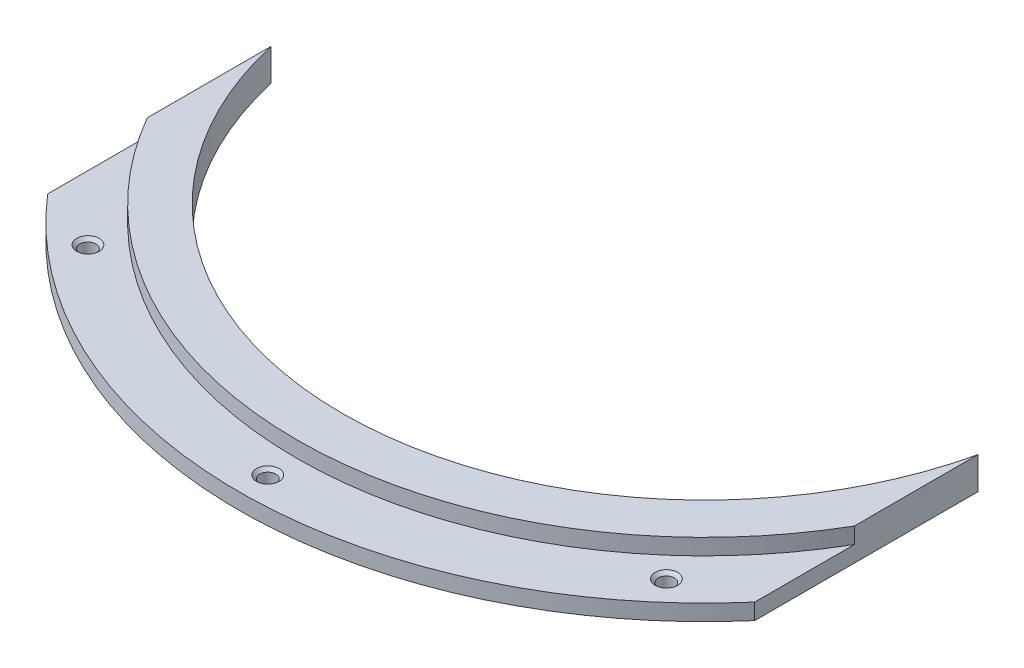
ISO-10303-21;
HEADER;
FILE_DESCRIPTION(('STEP AP214'),'2;1');
FILE_NAME('part.step','',(''),(''),'','','');
FILE_SCHEMA(('AUTOMOTIVE_DESIGN { 1 0 10303 214 1 1 1 1 }'));
ENDSEC;
DATA;
#1=APPLICATION_CONTEXT('core data for automotive mechanical design processes');
#2=APPLICATION_PROTOCOL_DEFINITION('international standard','automotive_design',2000,#1);
#3=PRODUCT_CONTEXT('',#1,'mechanical');
#4=PRODUCT('Part','Part','',(#3));
#5=PRODUCT_RELATED_PRODUCT_CATEGORY('part','',(#4));
#6=PRODUCT_DEFINITION_FORMATION('','',#4);
#7=PRODUCT_DEFINITION_CONTEXT('part definition',#1,'design');
#8=PRODUCT_DEFINITION('design','',#6,#7);
#9=PRODUCT_DEFINITION_SHAPE('','',#8);
#10=(LENGTH_UNIT() NAMED_UNIT(*) SI_UNIT(.MILLI.,.METRE.));
#11=(NAMED_UNIT(*) PLANE_ANGLE_UNIT() SI_UNIT($,.RADIAN.));
#12=(NAMED_UNIT(*) SI_UNIT($,.STERADIAN.) SOLID_ANGLE_UNIT());
#13=UNCERTAINTY_MEASURE_WITH_UNIT(LENGTH_MEASURE(1.E-05),#10,'distance_accuracy_value','');
#14=(GEOMETRIC_REPRESENTATION_CONTEXT(3) GLOBAL_UNCERTAINTY_ASSIGNED_CONTEXT((#13)) GLOBAL_UNIT_ASSIGNED_CONTEXT((#10,
#11,#12)) REPRESENTATION_CONTEXT('',''));
#15=CARTESIAN_POINT('',(0.,0.,0.));
#16=DIRECTION('',(0.,0.,1.));
#17=DIRECTION('',(1.,0.,0.));
#18=AXIS2_PLACEMENT_3D('',#15,#16,#17);
#19=CARTESIAN_POINT('',(139.7,12.7,-279.4));
#20=DIRECTION('',(0.,-1.,0.));
#21=DIRECTION('',(0.,0.,-1.));
#22=AXIS2_PLACEMENT_3D('',#19,#20,#21);
#23=CYLINDRICAL_SURFACE('',#22,161.29);
#24=CARTESIAN_POINT('',(139.7,6.35,-279.4));
#25=DIRECTION('',(0.,1.,0.));
#26=DIRECTION('',(0.,0.,-1.));
#27=AXIS2_PLACEMENT_3D('',#24,#25,#26);
#28=CIRCLE('',#27,161.29);
#29=CARTESIAN_POINT('',(0.,6.35,-198.787506551404));
#30=VERTEX_POINT('',#29);
#31=CARTESIAN_POINT('',(279.4,6.35,-198.787506551404));
#32=VERTEX_POINT('',#31);
#33=EDGE_CURVE('E68',#30,#32,#28,.T.);
#34=ORIENTED_EDGE('',*,*,#33,.T.);
#35=DIRECTION('',(0.,-1.,0.));
#36=VECTOR('',#35,1.);
#37=CARTESIAN_POINT('',(279.4,12.7,-198.787506551404));
#38=LINE('',#37,#36);
#39=CARTESIAN_POINT('',(279.4,12.7,-198.787506551404));
#40=VERTEX_POINT('',#39);
#41=EDGE_CURVE('E129',#40,#32,#38,.T.);
#42=ORIENTED_EDGE('',*,*,#41,.F.);
#43=CARTESIAN_POINT('',(139.7,12.7,-279.4));
#44=DIRECTION('',(0.,1.,0.));
#45=DIRECTION('',(0.,0.,1.));
#46=AXIS2_PLACEMENT_3D('',#43,#44,#45);
#47=CIRCLE('',#46,161.29);
#48=CARTESIAN_POINT('',(0.,12.7,-198.787506551404));
#49=VERTEX_POINT('',#48);
#50=EDGE_CURVE('E139',#49,#40,#47,.T.);
#51=ORIENTED_EDGE('',*,*,#50,.F.);
#52=DIRECTION('',(0.,-1.,0.));
#53=VECTOR('',#52,1.);
#54=CARTESIAN_POINT('',(0.,12.7,-198.787506551404));
#55=LINE('',#54,#53);
#56=EDGE_CURVE('E73',#49,#30,#55,.T.);
#57=ORIENTED_EDGE('',*,*,#56,.T.);
#58=EDGE_LOOP('',(#34,#42,#51,#57));
#59=FACE_BOUND('',#58,.T.);
#60=ADVANCED_FACE('F52',(#59),#23,.T.);
#61=CARTESIAN_POINT('',(279.4,12.7,-247.65));
#62=DIRECTION('',(-1.,0.,0.));
#63=DIRECTION('',(0.,0.,1.));
#64=AXIS2_PLACEMENT_3D('',#61,#62,#63);
#65=PLANE('',#64);
#66=DIRECTION('',(0.,0.,-1.));
#67=VECTOR('',#66,1.);
#68=CARTESIAN_POINT('',(279.4,0.,-247.65));
#69=LINE('',#68,#67);
#70=CARTESIAN_POINT('',(279.4,0.,-159.420282964161));
#71=VERTEX_POINT('',#70);
#72=CARTESIAN_POINT('',(279.4,0.,-247.65));
#73=VERTEX_POINT('',#72);
#74=EDGE_CURVE('E137',#71,#73,#69,.T.);
#75=ORIENTED_EDGE('',*,*,#74,.T.);
#76=DIRECTION('',(0.,-1.,0.));
#77=VECTOR('',#76,1.);
#78=CARTESIAN_POINT('',(279.4,12.7,-247.65));
#79=LINE('',#78,#77);
#80=CARTESIAN_POINT('',(279.4,12.7,-247.65));
#81=VERTEX_POINT('',#80);
#82=EDGE_CURVE('E161',#81,#73,#79,.T.);
#83=ORIENTED_EDGE('',*,*,#82,.F.);
#84=DIRECTION('',(0.,0.,-1.));
#85=VECTOR('',#84,1.);
#86=CARTESIAN_POINT('',(279.4,12.7,-247.65));
#87=LINE('',#86,#85);
#88=EDGE_CURVE('E142',#40,#81,#87,.T.);
#89=ORIENTED_EDGE('',*,*,#88,.F.);
#90=ORIENTED_EDGE('',*,*,#41,.T.);
#91=DIRECTION('',(0.,0.,1.));
#92=VECTOR('',#91,1.);
#93=CARTESIAN_POINT('',(279.4,6.35,-198.787506551404));
#94=LINE('',#93,#92);
#95=CARTESIAN_POINT('',(279.4,6.35,-159.420282964161));
#96=VERTEX_POINT('',#95);
#97=EDGE_CURVE('E125',#32,#96,#94,.T.);
#98=ORIENTED_EDGE('',*,*,#97,.T.);
#99=DIRECTION('',(0.,-1.,0.));
#100=VECTOR('',#99,1.);
#101=CARTESIAN_POINT('',(279.4,6.35,-159.420282964161));
#102=LINE('',#101,#100);
#103=EDGE_CURVE('E109',#96,#71,#102,.T.);
#104=ORIENTED_EDGE('',*,*,#103,.T.);
#105=EDGE_LOOP('',(#75,#83,#89,#90,#98,#104));
#106=FACE_BOUND('',#105,.T.);
#107=ADVANCED_FACE('F128',(#106),#65,.F.);
#108=CARTESIAN_POINT('',(139.7,12.7,-279.4));
#109=DIRECTION('',(0.,-1.,0.));
#110=DIRECTION('',(0.,0.,-1.));
#111=AXIS2_PLACEMENT_3D('',#108,#109,#110);
#112=CYLINDRICAL_SURFACE('',#111,143.262529993017);
#113=CARTESIAN_POINT('',(139.7,0.,-279.4));
#114=DIRECTION('',(0.,-1.,0.));
#115=DIRECTION('',(0.,0.,1.));
#116=AXIS2_PLACEMENT_3D('',#113,#114,#115);
#117=CIRCLE('',#116,143.262529993017);
#118=CARTESIAN_POINT('',(0.,0.,-247.65));
#119=VERTEX_POINT('',#118);
#120=EDGE_CURVE('E153',#73,#119,#117,.T.);
#121=ORIENTED_EDGE('',*,*,#120,.T.);
#122=DIRECTION('',(0.,-1.,0.));
#123=VECTOR('',#122,1.);
#124=CARTESIAN_POINT('',(0.,12.7,-247.65));
#125=LINE('',#124,#123);
#126=CARTESIAN_POINT('',(0.,12.7,-247.65));
#127=VERTEX_POINT('',#126);
#128=EDGE_CURVE('E158',#127,#119,#125,.T.);
#129=ORIENTED_EDGE('',*,*,#128,.F.);
#130=CARTESIAN_POINT('',(139.7,12.7,-279.4));
#131=DIRECTION('',(0.,-1.,0.));
#132=DIRECTION('',(0.,0.,1.));
#133=AXIS2_PLACEMENT_3D('',#130,#131,#132);
#134=CIRCLE('',#133,143.262529993017);
#135=EDGE_CURVE('E146',#81,#127,#134,.T.);
#136=ORIENTED_EDGE('',*,*,#135,.F.);
#137=ORIENTED_EDGE('',*,*,#82,.T.);
#138=EDGE_LOOP('',(#121,#129,#136,#137));
#139=FACE_BOUND('',#138,.T.);
#140=ADVANCED_FACE('F201',(#139),#112,.F.);
#141=CARTESIAN_POINT('',(0.,12.7,-198.787506551404));
#142=DIRECTION('',(1.,0.,0.));
#143=DIRECTION('',(0.,0.,-1.));
#144=AXIS2_PLACEMENT_3D('',#141,#142,#143);
#145=PLANE('',#144);
#146=DIRECTION('',(0.,0.,1.));
#147=VECTOR('',#146,1.);
#148=CARTESIAN_POINT('',(0.,0.,-198.787506551404));
#149=LINE('',#148,#147);
#150=CARTESIAN_POINT('',(0.,0.,-159.420282964161));
#151=VERTEX_POINT('',#150);
#152=EDGE_CURVE('E143',#119,#151,#149,.T.);
#153=ORIENTED_EDGE('',*,*,#152,.T.);
#154=DIRECTION('',(0.,-1.,0.));
#155=VECTOR('',#154,1.);
#156=CARTESIAN_POINT('',(0.,6.35,-159.420282964161));
#157=LINE('',#156,#155);
#158=CARTESIAN_POINT('',(0.,6.35,-159.420282964161));
#159=VERTEX_POINT('',#158);
#160=EDGE_CURVE('E119',#159,#151,#157,.T.);
#161=ORIENTED_EDGE('',*,*,#160,.F.);
#162=DIRECTION('',(0.,0.,-1.));
#163=VECTOR('',#162,1.);
#164=CARTESIAN_POINT('',(0.,6.35,-198.787506551404));
#165=LINE('',#164,#163);
#166=EDGE_CURVE('E120',#159,#30,#165,.T.);
#167=ORIENTED_EDGE('',*,*,#166,.T.);
#168=ORIENTED_EDGE('',*,*,#56,.F.);
#169=DIRECTION('',(0.,0.,1.));
#170=VECTOR('',#169,1.);
#171=CARTESIAN_POINT('',(0.,12.7,-198.787506551404));
#172=LINE('',#171,#170);
#173=EDGE_CURVE('E149',#127,#49,#172,.T.);
#174=ORIENTED_EDGE('',*,*,#173,.F.);
#175=ORIENTED_EDGE('',*,*,#128,.T.);
#176=EDGE_LOOP('',(#153,#161,#167,#168,#174,#175));
#177=FACE_BOUND('',#176,.T.);
#178=ADVANCED_FACE('F213',(#177),#145,.F.);
#179=CARTESIAN_POINT('',(139.7,12.7,-279.4));
#180=DIRECTION('',(0.,1.,0.));
#181=DIRECTION('',(0.,0.,1.));
#182=AXIS2_PLACEMENT_3D('',#179,#180,#181);
#183=PLANE('',#182);
#184=ORIENTED_EDGE('',*,*,#50,.T.);
#185=ORIENTED_EDGE('',*,*,#88,.T.);
#186=ORIENTED_EDGE('',*,*,#135,.T.);
#187=ORIENTED_EDGE('',*,*,#173,.T.);
#188=EDGE_LOOP('',(#184,#185,#186,#187));
#189=FACE_BOUND('',#188,.T.);
#190=ADVANCED_FACE('F217',(#189),#183,.T.);
#191=CARTESIAN_POINT('',(139.7,0.,-279.4));
#192=DIRECTION('',(0.,1.,0.));
#193=DIRECTION('',(0.,0.,1.));
#194=AXIS2_PLACEMENT_3D('',#191,#192,#193);
#195=PLANE('',#194);
#196=CARTESIAN_POINT('',(139.7,0.,-106.68));
#197=DIRECTION('',(0.,1.,0.));
#198=DIRECTION('',(0.,0.,1.));
#199=AXIS2_PLACEMENT_3D('',#196,#197,#198);
#200=CIRCLE('',#199,3.175);
#201=CARTESIAN_POINT('',(139.7,0.,-103.505));
#202=VERTEX_POINT('',#201);
#203=EDGE_CURVE('E136',#202,#202,#200,.T.);
#204=ORIENTED_EDGE('',*,*,#203,.T.);
#205=EDGE_LOOP('',(#204));
#206=FACE_BOUND('',#205,.T.);
#207=CARTESIAN_POINT('',(25.4,0.,-149.909813499246));
#208=DIRECTION('',(0.,1.,0.));
#209=DIRECTION('',(0.,0.,1.));
#210=AXIS2_PLACEMENT_3D('',#207,#208,#209);
#211=CIRCLE('',#210,3.175);
#212=CARTESIAN_POINT('',(25.4,0.,-146.734813499246));
#213=VERTEX_POINT('',#212);
#214=EDGE_CURVE('E393',#213,#213,#211,.T.);
#215=ORIENTED_EDGE('',*,*,#214,.T.);
#216=EDGE_LOOP('',(#215));
#217=FACE_BOUND('',#216,.T.);
#218=CARTESIAN_POINT('',(254.,0.,-149.909813499246));
#219=DIRECTION('',(0.,1.,0.));
#220=DIRECTION('',(0.,0.,1.));
#221=AXIS2_PLACEMENT_3D('',#218,#219,#220);
#222=CIRCLE('',#221,3.17499999999997);
#223=CARTESIAN_POINT('',(254.,0.,-146.734813499246));
#224=VERTEX_POINT('',#223);
#225=EDGE_CURVE('E395',#224,#224,#222,.T.);
#226=ORIENTED_EDGE('',*,*,#225,.T.);
#227=EDGE_LOOP('',(#226));
#228=FACE_BOUND('',#227,.T.);
#229=ORIENTED_EDGE('',*,*,#74,.F.);
#230=CARTESIAN_POINT('',(139.7,0.,-279.4));
#231=DIRECTION('',(0.,-1.,0.));
#232=DIRECTION('',(0.,0.,-1.));
#233=AXIS2_PLACEMENT_3D('',#230,#231,#232);
#234=CIRCLE('',#233,184.15);
#235=EDGE_CURVE('E116',#71,#151,#234,.T.);
#236=ORIENTED_EDGE('',*,*,#235,.T.);
#237=ORIENTED_EDGE('',*,*,#152,.F.);
#238=ORIENTED_EDGE('',*,*,#120,.F.);
#239=EDGE_LOOP('',(#229,#236,#237,#238));
#240=FACE_BOUND('',#239,.T.);
#241=ADVANCED_FACE('F219',(#206,#217,#228,#240),#195,.F.);
#242=CARTESIAN_POINT('',(139.7,6.35,-279.4));
#243=DIRECTION('',(0.,-1.,0.));
#244=DIRECTION('',(0.,0.,-1.));
#245=AXIS2_PLACEMENT_3D('',#242,#243,#244);
#246=CYLINDRICAL_SURFACE('',#245,184.15);
#247=ORIENTED_EDGE('',*,*,#235,.F.);
#248=ORIENTED_EDGE('',*,*,#103,.F.);
#249=CARTESIAN_POINT('',(139.7,6.35,-279.4));
#250=DIRECTION('',(0.,-1.,0.));
#251=DIRECTION('',(0.,0.,-1.));
#252=AXIS2_PLACEMENT_3D('',#249,#250,#251);
#253=CIRCLE('',#252,184.15);
#254=EDGE_CURVE('E113',#96,#159,#253,.T.);
#255=ORIENTED_EDGE('',*,*,#254,.T.);
#256=ORIENTED_EDGE('',*,*,#160,.T.);
#257=EDGE_LOOP('',(#247,#248,#255,#256));
#258=FACE_BOUND('',#257,.T.);
#259=ADVANCED_FACE('F111',(#258),#246,.T.);
#260=CARTESIAN_POINT('',(139.7,6.35,-279.4));
#261=DIRECTION('',(0.,-1.,0.));
#262=DIRECTION('',(0.,0.,-1.));
#263=AXIS2_PLACEMENT_3D('',#260,#261,#262);
#264=PLANE('',#263);
#265=CARTESIAN_POINT('',(254.,6.35,-149.909813499246));
#266=DIRECTION('',(0.,-1.,0.));
#267=DIRECTION('',(0.,0.,-1.));
#268=AXIS2_PLACEMENT_3D('',#265,#266,#267);
#269=CIRCLE('',#268,4.445);
#270=CARTESIAN_POINT('',(254.,6.35,-154.354813499246));
#271=VERTEX_POINT('',#270);
#272=EDGE_CURVE('E175',#271,#271,#269,.T.);
#273=ORIENTED_EDGE('',*,*,#272,.T.);
#274=EDGE_LOOP('',(#273));
#275=FACE_BOUND('',#274,.T.);
#276=CARTESIAN_POINT('',(139.7,6.35,-106.68));
#277=DIRECTION('',(0.,-1.,0.));
#278=DIRECTION('',(0.,0.,-1.));
#279=AXIS2_PLACEMENT_3D('',#276,#277,#278);
#280=CIRCLE('',#279,4.445);
#281=CARTESIAN_POINT('',(139.7,6.35,-111.125));
#282=VERTEX_POINT('',#281);
#283=EDGE_CURVE('E172',#282,#282,#280,.T.);
#284=ORIENTED_EDGE('',*,*,#283,.T.);
#285=EDGE_LOOP('',(#284));
#286=FACE_BOUND('',#285,.T.);
#287=CARTESIAN_POINT('',(25.4,6.35,-149.909813499246));
#288=DIRECTION('',(0.,-1.,0.));
#289=DIRECTION('',(0.,0.,-1.));
#290=AXIS2_PLACEMENT_3D('',#287,#288,#289);
#291=CIRCLE('',#290,4.44499999999995);
#292=CARTESIAN_POINT('',(25.4,6.35,-154.354813499246));
#293=VERTEX_POINT('',#292);
#294=EDGE_CURVE('E169',#293,#293,#291,.T.);
#295=ORIENTED_EDGE('',*,*,#294,.T.);
#296=EDGE_LOOP('',(#295));
#297=FACE_BOUND('',#296,.T.);
#298=ORIENTED_EDGE('',*,*,#33,.F.);
#299=ORIENTED_EDGE('',*,*,#166,.F.);
#300=ORIENTED_EDGE('',*,*,#254,.F.);
#301=ORIENTED_EDGE('',*,*,#97,.F.);
#302=EDGE_LOOP('',(#298,#299,#300,#301));
#303=FACE_BOUND('',#302,.T.);
#304=ADVANCED_FACE('F124',(#275,#286,#297,#303),#264,.F.);
#305=CARTESIAN_POINT('',(254.,-6.35,-149.909813499246));
#306=DIRECTION('',(0.,1.,0.));
#307=DIRECTION('',(0.,0.,1.));
#308=AXIS2_PLACEMENT_3D('',#305,#306,#307);
#309=CYLINDRICAL_SURFACE('',#308,3.17499999999997);
#310=CARTESIAN_POINT('',(254.,5.07999999999998,-149.909813499246));
#311=DIRECTION('',(0.,-1.,0.));
#312=DIRECTION('',(0.,0.,-1.));
#313=AXIS2_PLACEMENT_3D('',#310,#311,#312);
#314=CIRCLE('',#313,3.17499999999997);
#315=CARTESIAN_POINT('',(254.,5.07999999999998,-153.084813499246));
#316=VERTEX_POINT('',#315);
#317=EDGE_CURVE('E166',#316,#316,#314,.F.);
#318=ORIENTED_EDGE('',*,*,#317,.T.);
#319=EDGE_LOOP('',(#318));
#320=FACE_BOUND('',#319,.T.);
#321=ORIENTED_EDGE('',*,*,#225,.F.);
#322=EDGE_LOOP('',(#321));
#323=FACE_BOUND('',#322,.T.);
#324=ADVANCED_FACE('F230',(#320,#323),#309,.F.);
#325=CARTESIAN_POINT('',(25.4,-6.35,-149.909813499246));
#326=DIRECTION('',(0.,1.,0.));
#327=DIRECTION('',(0.,0.,1.));
#328=AXIS2_PLACEMENT_3D('',#325,#326,#327);
#329=CYLINDRICAL_SURFACE('',#328,3.175);
#330=CARTESIAN_POINT('',(25.4,5.08000000000004,-149.909813499246));
#331=DIRECTION('',(0.,-1.,0.));
#332=DIRECTION('',(0.,0.,-1.));
#333=AXIS2_PLACEMENT_3D('',#330,#331,#332);
#334=CIRCLE('',#333,3.175);
#335=CARTESIAN_POINT('',(25.4,5.08000000000004,-153.084813499246));
#336=VERTEX_POINT('',#335);
#337=EDGE_CURVE('E11',#336,#336,#334,.F.);
#338=ORIENTED_EDGE('',*,*,#337,.T.);
#339=EDGE_LOOP('',(#338));
#340=FACE_BOUND('',#339,.T.);
#341=ORIENTED_EDGE('',*,*,#214,.F.);
#342=EDGE_LOOP('',(#341));
#343=FACE_BOUND('',#342,.T.);
#344=ADVANCED_FACE('F234',(#340,#343),#329,.F.);
#345=CARTESIAN_POINT('',(139.7,-6.35,-106.68));
#346=DIRECTION('',(0.,1.,0.));
#347=DIRECTION('',(0.,0.,1.));
#348=AXIS2_PLACEMENT_3D('',#345,#346,#347);
#349=CYLINDRICAL_SURFACE('',#348,3.175);
#350=CARTESIAN_POINT('',(139.7,5.08000000000001,-106.68));
#351=DIRECTION('',(0.,-1.,0.));
#352=DIRECTION('',(0.,0.,-1.));
#353=AXIS2_PLACEMENT_3D('',#350,#351,#352);
#354=CIRCLE('',#353,3.175);
#355=CARTESIAN_POINT('',(139.7,5.08000000000001,-109.855));
#356=VERTEX_POINT('',#355);
#357=EDGE_CURVE('E61',#356,#356,#354,.F.);
#358=ORIENTED_EDGE('',*,*,#357,.T.);
#359=EDGE_LOOP('',(#358));
#360=FACE_BOUND('',#359,.T.);
#361=ORIENTED_EDGE('',*,*,#203,.F.);
#362=EDGE_LOOP('',(#361));
#363=FACE_BOUND('',#362,.T.);
#364=ADVANCED_FACE('F180',(#360,#363),#349,.F.);
#365=CARTESIAN_POINT('',(254.,5.07999999999998,-149.909813499246));
#366=DIRECTION('',(0.,1.,0.));
#367=DIRECTION('',(0.,0.,1.));
#368=AXIS2_PLACEMENT_3D('',#365,#366,#367);
#369=CONICAL_SURFACE('',#368,3.17499999999997,0.785398163397455);
#370=ORIENTED_EDGE('',*,*,#272,.F.);
#371=EDGE_LOOP('',(#370));
#372=FACE_BOUND('',#371,.T.);
#373=ORIENTED_EDGE('',*,*,#317,.F.);
#374=EDGE_LOOP('',(#373));
#375=FACE_BOUND('',#374,.T.);
#376=ADVANCED_FACE('F185',(#372,#375),#369,.F.);
#377=CARTESIAN_POINT('',(139.7,5.08000000000001,-106.68));
#378=DIRECTION('',(0.,1.,0.));
#379=DIRECTION('',(0.,0.,1.));
#380=AXIS2_PLACEMENT_3D('',#377,#378,#379);
#381=CONICAL_SURFACE('',#380,3.175,0.785398163397455);
#382=ORIENTED_EDGE('',*,*,#283,.F.);
#383=EDGE_LOOP('',(#382));
#384=FACE_BOUND('',#383,.T.);
#385=ORIENTED_EDGE('',*,*,#357,.F.);
#386=EDGE_LOOP('',(#385));
#387=FACE_BOUND('',#386,.T.);
#388=ADVANCED_FACE('F183',(#384,#387),#381,.F.);
#389=CARTESIAN_POINT('',(25.4,5.08000000000004,-149.909813499246));
#390=DIRECTION('',(0.,1.,0.));
#391=DIRECTION('',(0.,0.,1.));
#392=AXIS2_PLACEMENT_3D('',#389,#390,#391);
#393=CONICAL_SURFACE('',#392,3.175,0.785398163397444);
#394=ORIENTED_EDGE('',*,*,#294,.F.);
#395=EDGE_LOOP('',(#394));
#396=FACE_BOUND('',#395,.T.);
#397=ORIENTED_EDGE('',*,*,#337,.F.);
#398=EDGE_LOOP('',(#397));
#399=FACE_BOUND('',#398,.T.);
#400=ADVANCED_FACE('F55',(#396,#399),#393,.F.);
#401=CLOSED_SHELL('',(#60,#107,#140,#178,#190,#241,#259,#304,#324,#344,#364,#376,#388,#400));
#402=MANIFOLD_SOLID_BREP('B2',#401);
#403=ADVANCED_BREP_SHAPE_REPRESENTATION('',(#18,#402),#14);
#404=SHAPE_DEFINITION_REPRESENTATION(#9,#403);
ENDSEC;
END-ISO-10303-21;
